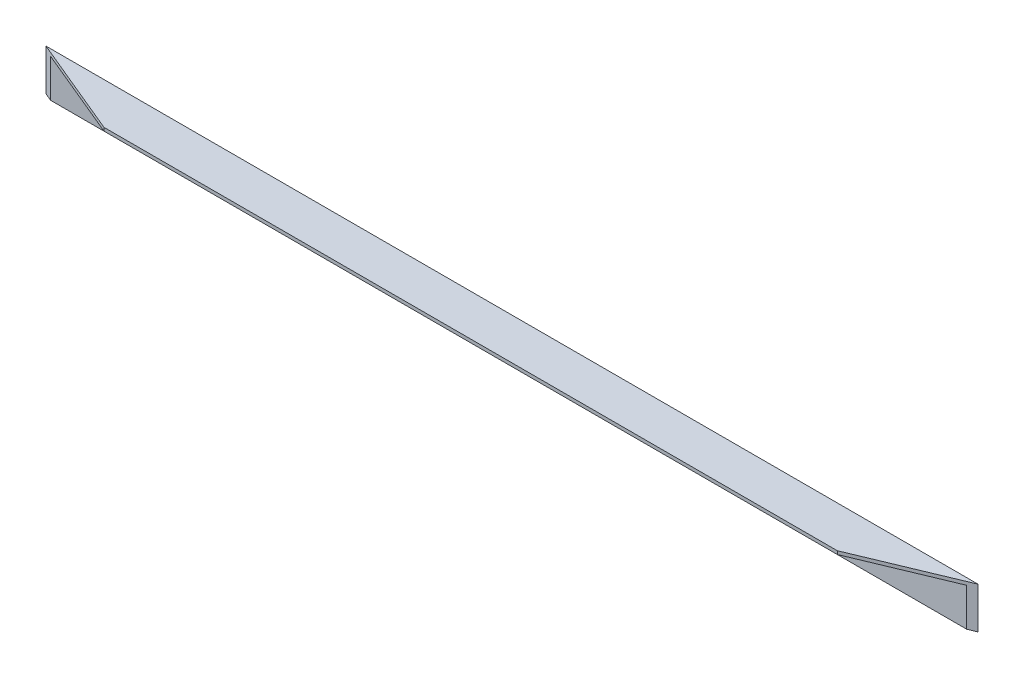
ISO-10303-21;
HEADER;
FILE_DESCRIPTION(('STEP AP214'),'2;1');
FILE_NAME('part.step','',(''),(''),'','','');
FILE_SCHEMA(('AUTOMOTIVE_DESIGN { 1 0 10303 214 1 1 1 1 }'));
ENDSEC;
DATA;
#1=APPLICATION_CONTEXT('core data for automotive mechanical design processes');
#2=APPLICATION_PROTOCOL_DEFINITION('international standard','automotive_design',2000,#1);
#3=PRODUCT_CONTEXT('',#1,'mechanical');
#4=PRODUCT('Part','Part','',(#3));
#5=PRODUCT_RELATED_PRODUCT_CATEGORY('part','',(#4));
#6=PRODUCT_DEFINITION_FORMATION('','',#4);
#7=PRODUCT_DEFINITION_CONTEXT('part definition',#1,'design');
#8=PRODUCT_DEFINITION('design','',#6,#7);
#9=PRODUCT_DEFINITION_SHAPE('','',#8);
#10=(LENGTH_UNIT() NAMED_UNIT(*) SI_UNIT(.MILLI.,.METRE.));
#11=(NAMED_UNIT(*) PLANE_ANGLE_UNIT() SI_UNIT($,.RADIAN.));
#12=(NAMED_UNIT(*) SI_UNIT($,.STERADIAN.) SOLID_ANGLE_UNIT());
#13=UNCERTAINTY_MEASURE_WITH_UNIT(LENGTH_MEASURE(1.E-05),#10,'distance_accuracy_value','');
#14=(GEOMETRIC_REPRESENTATION_CONTEXT(3) GLOBAL_UNCERTAINTY_ASSIGNED_CONTEXT((#13)) GLOBAL_UNIT_ASSIGNED_CONTEXT((#10,
#11,#12)) REPRESENTATION_CONTEXT('',''));
#15=CARTESIAN_POINT('',(0.,0.,0.));
#16=DIRECTION('',(0.,0.,1.));
#17=DIRECTION('',(1.,0.,0.));
#18=AXIS2_PLACEMENT_3D('',#15,#16,#17);
#19=CARTESIAN_POINT('',(-1126.,-7.85482789922298E-12,8.));
#20=DIRECTION('',(0.,1.,0.));
#21=DIRECTION('',(-1.,0.,0.));
#22=AXIS2_PLACEMENT_3D('',#19,#20,#21);
#23=PLANE('',#22);
#24=DIRECTION('',(0.923076923076923,0.,0.384615384615384));
#25=VECTOR('',#24,1.);
#26=CARTESIAN_POINT('',(-1123.15976331361,-7.84492134044649E-12,1.18343195266321));
#27=LINE('',#26,#25);
#28=CARTESIAN_POINT('',(-1126.,-7.85482789922298E-12,0.));
#29=VERTEX_POINT('',#28);
#30=CARTESIAN_POINT('',(-1106.8,-3.95516952522712E-12,8.));
#31=VERTEX_POINT('',#30);
#32=EDGE_CURVE('E132',#29,#31,#27,.T.);
#33=ORIENTED_EDGE('',*,*,#32,.F.);
#34=DIRECTION('',(1.,0.,0.));
#35=VECTOR('',#34,1.);
#36=CARTESIAN_POINT('',(-1126.,-7.85482789922298E-12,0.));
#37=LINE('',#36,#35);
#38=CARTESIAN_POINT('',(1126.,-7.85482789922298E-12,0.));
#39=VERTEX_POINT('',#38);
#40=EDGE_CURVE('E106',#29,#39,#37,.T.);
#41=ORIENTED_EDGE('',*,*,#40,.T.);
#42=DIRECTION('',(-0.923076923076923,0.,0.384615384615384));
#43=VECTOR('',#42,1.);
#44=CARTESIAN_POINT('',(-795.704142011834,-6.70277766817359E-12,800.710059171597));
#45=LINE('',#44,#43);
#46=CARTESIAN_POINT('',(1106.8,-3.92741394961149E-12,8.));
#47=VERTEX_POINT('',#46);
#48=EDGE_CURVE('E130',#39,#47,#45,.T.);
#49=ORIENTED_EDGE('',*,*,#48,.T.);
#50=DIRECTION('',(1.,0.,0.));
#51=VECTOR('',#50,1.);
#52=CARTESIAN_POINT('',(-1126.,-7.85482789922298E-12,8.));
#53=LINE('',#52,#51);
#54=EDGE_CURVE('E112',#31,#47,#53,.T.);
#55=ORIENTED_EDGE('',*,*,#54,.F.);
#56=EDGE_LOOP('',(#33,#41,#49,#55));
#57=FACE_BOUND('',#56,.T.);
#58=ADVANCED_FACE('F36',(#57),#23,.F.);
#59=CARTESIAN_POINT('',(1126.,100.,8.));
#60=DIRECTION('',(0.,-1.,0.));
#61=DIRECTION('',(1.,0.,0.));
#62=AXIS2_PLACEMENT_3D('',#59,#60,#61);
#63=PLANE('',#62);
#64=DIRECTION('',(0.923076923076923,0.,0.384615384615384));
#65=VECTOR('',#64,1.);
#66=CARTESIAN_POINT('',(-886.,99.9999999999992,100.));
#67=LINE('',#66,#65);
#68=CARTESIAN_POINT('',(-1126.,100.,0.));
#69=VERTEX_POINT('',#68);
#70=CARTESIAN_POINT('',(-886.,99.9999999999992,100.));
#71=VERTEX_POINT('',#70);
#72=EDGE_CURVE('E89',#69,#71,#67,.T.);
#73=ORIENTED_EDGE('',*,*,#72,.T.);
#74=DIRECTION('',(-1.,0.,0.));
#75=VECTOR('',#74,1.);
#76=CARTESIAN_POINT('',(-1126.,99.9999999999921,100.));
#77=LINE('',#76,#75);
#78=CARTESIAN_POINT('',(886.,99.9999999999921,100.));
#79=VERTEX_POINT('',#78);
#80=EDGE_CURVE('E97',#79,#71,#77,.T.);
#81=ORIENTED_EDGE('',*,*,#80,.F.);
#82=DIRECTION('',(-0.923076923076923,0.,0.384615384615384));
#83=VECTOR('',#82,1.);
#84=CARTESIAN_POINT('',(886.,99.9999999999992,100.));
#85=LINE('',#84,#83);
#86=CARTESIAN_POINT('',(1126.,100.,0.));
#87=VERTEX_POINT('',#86);
#88=EDGE_CURVE('E59',#87,#79,#85,.T.);
#89=ORIENTED_EDGE('',*,*,#88,.F.);
#90=DIRECTION('',(-1.,0.,0.));
#91=VECTOR('',#90,1.);
#92=CARTESIAN_POINT('',(1126.,100.,0.));
#93=LINE('',#92,#91);
#94=EDGE_CURVE('E99',#87,#69,#93,.T.);
#95=ORIENTED_EDGE('',*,*,#94,.T.);
#96=EDGE_LOOP('',(#73,#81,#89,#95));
#97=FACE_BOUND('',#96,.T.);
#98=ADVANCED_FACE('F96',(#97),#63,.F.);
#99=CARTESIAN_POINT('',(-1126.,99.9999999999921,8.));
#100=DIRECTION('',(0.,0.,1.));
#101=DIRECTION('',(1.,0.,0.));
#102=AXIS2_PLACEMENT_3D('',#99,#100,#101);
#103=PLANE('',#102);
#104=DIRECTION('',(1.,0.,0.));
#105=VECTOR('',#104,1.);
#106=CARTESIAN_POINT('',(-1126.,91.9999999999921,8.));
#107=LINE('',#106,#105);
#108=CARTESIAN_POINT('',(-1106.8,91.9999999999921,8.00000000000001));
#109=VERTEX_POINT('',#108);
#110=CARTESIAN_POINT('',(1106.8,91.9999999999921,7.99999999999989));
#111=VERTEX_POINT('',#110);
#112=EDGE_CURVE('E39',#109,#111,#107,.T.);
#113=ORIENTED_EDGE('',*,*,#112,.F.);
#114=DIRECTION('',(0.,-1.,0.));
#115=VECTOR('',#114,1.);
#116=CARTESIAN_POINT('',(-1106.8,99.9999999999921,8.));
#117=LINE('',#116,#115);
#118=EDGE_CURVE('E144',#109,#31,#117,.T.);
#119=ORIENTED_EDGE('',*,*,#118,.T.);
#120=ORIENTED_EDGE('',*,*,#54,.T.);
#121=DIRECTION('',(0.,-1.,0.));
#122=VECTOR('',#121,1.);
#123=CARTESIAN_POINT('',(1106.8,99.9999999999999,8.));
#124=LINE('',#123,#122);
#125=EDGE_CURVE('E128',#111,#47,#124,.T.);
#126=ORIENTED_EDGE('',*,*,#125,.F.);
#127=EDGE_LOOP('',(#113,#119,#120,#126));
#128=FACE_BOUND('',#127,.T.);
#129=ADVANCED_FACE('F142',(#128),#103,.T.);
#130=CARTESIAN_POINT('',(-1126.,91.9999999999921,100.));
#131=DIRECTION('',(0.,1.,0.));
#132=DIRECTION('',(0.,0.,1.));
#133=AXIS2_PLACEMENT_3D('',#130,#131,#132);
#134=PLANE('',#133);
#135=DIRECTION('',(0.923076923076923,0.,0.384615384615384));
#136=VECTOR('',#135,1.);
#137=CARTESIAN_POINT('',(-1090.49704142012,91.9999999999921,14.792899408284));
#138=LINE('',#137,#136);
#139=CARTESIAN_POINT('',(-886.,91.9999999999921,100.));
#140=VERTEX_POINT('',#139);
#141=EDGE_CURVE('E52',#109,#140,#138,.T.);
#142=ORIENTED_EDGE('',*,*,#141,.F.);
#143=ORIENTED_EDGE('',*,*,#112,.T.);
#144=DIRECTION('',(-0.923076923076923,0.,0.384615384615384));
#145=VECTOR('',#144,1.);
#146=CARTESIAN_POINT('',(-828.366863905326,91.9999999999921,814.319526627218));
#147=LINE('',#146,#145);
#148=CARTESIAN_POINT('',(886.,91.9999999999921,100.));
#149=VERTEX_POINT('',#148);
#150=EDGE_CURVE('E123',#111,#149,#147,.T.);
#151=ORIENTED_EDGE('',*,*,#150,.T.);
#152=DIRECTION('',(1.,0.,0.));
#153=VECTOR('',#152,1.);
#154=CARTESIAN_POINT('',(-1126.,91.9999999999921,100.));
#155=LINE('',#154,#153);
#156=EDGE_CURVE('E104',#140,#149,#155,.T.);
#157=ORIENTED_EDGE('',*,*,#156,.F.);
#158=EDGE_LOOP('',(#142,#143,#151,#157));
#159=FACE_BOUND('',#158,.T.);
#160=ADVANCED_FACE('F126',(#159),#134,.F.);
#161=CARTESIAN_POINT('',(-1126.,91.9999999999921,100.));
#162=DIRECTION('',(0.,0.,1.));
#163=DIRECTION('',(1.,0.,0.));
#164=AXIS2_PLACEMENT_3D('',#161,#162,#163);
#165=PLANE('',#164);
#166=ORIENTED_EDGE('',*,*,#80,.T.);
#167=DIRECTION('',(0.,-1.,0.));
#168=VECTOR('',#167,1.);
#169=CARTESIAN_POINT('',(-886.,91.9999999999913,100.));
#170=LINE('',#169,#168);
#171=EDGE_CURVE('E11',#71,#140,#170,.T.);
#172=ORIENTED_EDGE('',*,*,#171,.T.);
#173=ORIENTED_EDGE('',*,*,#156,.T.);
#174=DIRECTION('',(0.,-1.,0.));
#175=VECTOR('',#174,1.);
#176=CARTESIAN_POINT('',(886.,91.9999999999992,100.));
#177=LINE('',#176,#175);
#178=EDGE_CURVE('E45',#79,#149,#177,.T.);
#179=ORIENTED_EDGE('',*,*,#178,.F.);
#180=EDGE_LOOP('',(#166,#172,#173,#179));
#181=FACE_BOUND('',#180,.T.);
#182=ADVANCED_FACE('F102',(#181),#165,.T.);
#183=CARTESIAN_POINT('',(-1126.,99.9999999999921,0.));
#184=DIRECTION('',(0.,0.,1.));
#185=DIRECTION('',(1.,0.,0.));
#186=AXIS2_PLACEMENT_3D('',#183,#184,#185);
#187=PLANE('',#186);
#188=DIRECTION('',(0.,-1.,0.));
#189=VECTOR('',#188,1.);
#190=CARTESIAN_POINT('',(-1126.,-7.85482789922298E-12,0.));
#191=LINE('',#190,#189);
#192=EDGE_CURVE('E103',#69,#29,#191,.T.);
#193=ORIENTED_EDGE('',*,*,#192,.F.);
#194=ORIENTED_EDGE('',*,*,#94,.F.);
#195=DIRECTION('',(0.,1.,0.));
#196=VECTOR('',#195,1.);
#197=CARTESIAN_POINT('',(1126.,0.,0.));
#198=LINE('',#197,#196);
#199=EDGE_CURVE('E116',#39,#87,#198,.T.);
#200=ORIENTED_EDGE('',*,*,#199,.F.);
#201=ORIENTED_EDGE('',*,*,#40,.F.);
#202=EDGE_LOOP('',(#193,#194,#200,#201));
#203=FACE_BOUND('',#202,.T.);
#204=ADVANCED_FACE('F148',(#203),#187,.F.);
#205=CARTESIAN_POINT('',(886.,-2.50000087020918E-05,100.));
#206=DIRECTION('',(-0.384615384615384,0.,-0.923076923076923));
#207=DIRECTION('',(-0.923076923076923,0.,0.384615384615384));
#208=AXIS2_PLACEMENT_3D('',#205,#206,#207);
#209=PLANE('',#208);
#210=ORIENTED_EDGE('',*,*,#199,.T.);
#211=ORIENTED_EDGE('',*,*,#88,.T.);
#212=ORIENTED_EDGE('',*,*,#178,.T.);
#213=ORIENTED_EDGE('',*,*,#150,.F.);
#214=ORIENTED_EDGE('',*,*,#125,.T.);
#215=ORIENTED_EDGE('',*,*,#48,.F.);
#216=EDGE_LOOP('',(#210,#211,#212,#213,#214,#215));
#217=FACE_BOUND('',#216,.T.);
#218=ADVANCED_FACE('F121',(#217),#209,.F.);
#219=CARTESIAN_POINT('',(-886.,-2.50000087020918E-05,100.));
#220=DIRECTION('',(-0.384615384615384,0.,0.923076923076923));
#221=DIRECTION('',(0.923076923076923,0.,0.384615384615384));
#222=AXIS2_PLACEMENT_3D('',#219,#220,#221);
#223=PLANE('',#222);
#224=ORIENTED_EDGE('',*,*,#32,.T.);
#225=ORIENTED_EDGE('',*,*,#118,.F.);
#226=ORIENTED_EDGE('',*,*,#141,.T.);
#227=ORIENTED_EDGE('',*,*,#171,.F.);
#228=ORIENTED_EDGE('',*,*,#72,.F.);
#229=ORIENTED_EDGE('',*,*,#192,.T.);
#230=EDGE_LOOP('',(#224,#225,#226,#227,#228,#229));
#231=FACE_BOUND('',#230,.T.);
#232=ADVANCED_FACE('F88',(#231),#223,.T.);
#233=CLOSED_SHELL('',(#58,#98,#129,#160,#182,#204,#218,#232));
#234=MANIFOLD_SOLID_BREP('B2',#233);
#235=ADVANCED_BREP_SHAPE_REPRESENTATION('',(#18,#234),#14);
#236=SHAPE_DEFINITION_REPRESENTATION(#9,#235);
ENDSEC;
END-ISO-10303-21;
